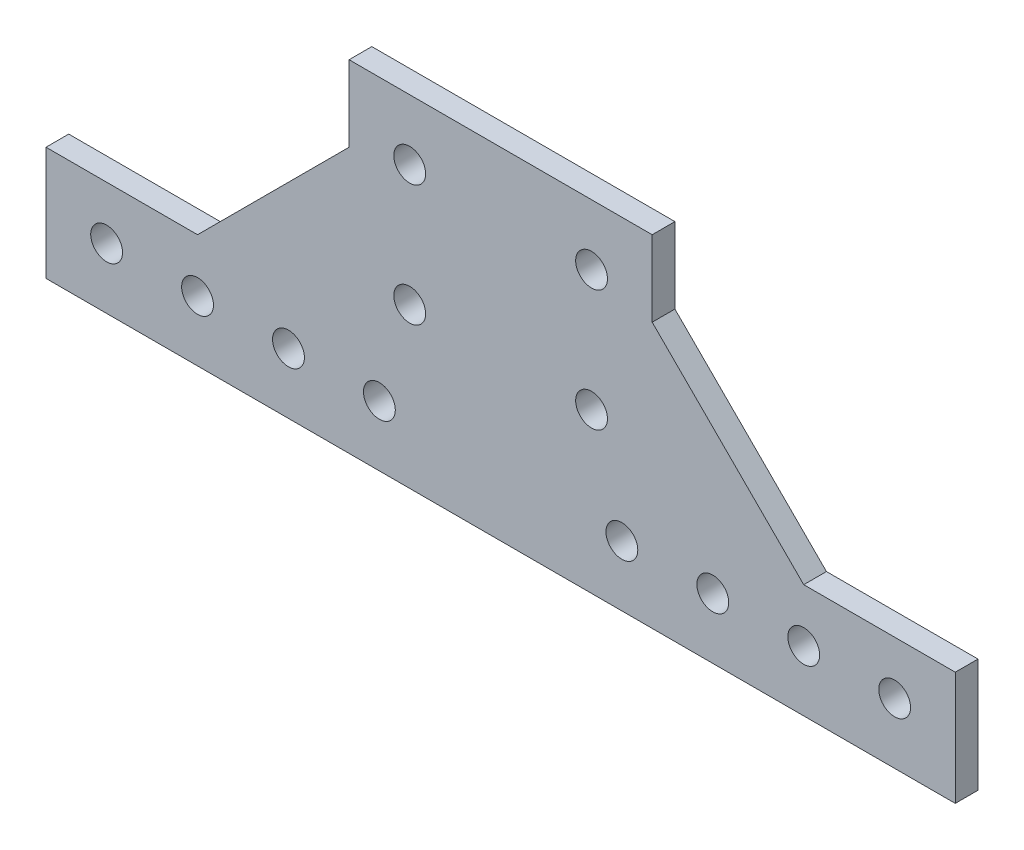
ISO-10303-21;
HEADER;
FILE_DESCRIPTION(('STEP AP214'),'2;1');
FILE_NAME('part.step','',(''),(''),'','','');
FILE_SCHEMA(('AUTOMOTIVE_DESIGN { 1 0 10303 214 1 1 1 1 }'));
ENDSEC;
DATA;
#1=APPLICATION_CONTEXT('core data for automotive mechanical design processes');
#2=APPLICATION_PROTOCOL_DEFINITION('international standard','automotive_design',2000,#1);
#3=PRODUCT_CONTEXT('',#1,'mechanical');
#4=PRODUCT('Part','Part','',(#3));
#5=PRODUCT_RELATED_PRODUCT_CATEGORY('part','',(#4));
#6=PRODUCT_DEFINITION_FORMATION('','',#4);
#7=PRODUCT_DEFINITION_CONTEXT('part definition',#1,'design');
#8=PRODUCT_DEFINITION('design','',#6,#7);
#9=PRODUCT_DEFINITION_SHAPE('','',#8);
#10=(LENGTH_UNIT() NAMED_UNIT(*) SI_UNIT(.MILLI.,.METRE.));
#11=(NAMED_UNIT(*) PLANE_ANGLE_UNIT() SI_UNIT($,.RADIAN.));
#12=(NAMED_UNIT(*) SI_UNIT($,.STERADIAN.) SOLID_ANGLE_UNIT());
#13=UNCERTAINTY_MEASURE_WITH_UNIT(LENGTH_MEASURE(1.E-05),#10,'distance_accuracy_value','');
#14=(GEOMETRIC_REPRESENTATION_CONTEXT(3) GLOBAL_UNCERTAINTY_ASSIGNED_CONTEXT((#13)) GLOBAL_UNIT_ASSIGNED_CONTEXT((#10,
#11,#12)) REPRESENTATION_CONTEXT('',''));
#15=CARTESIAN_POINT('',(0.,0.,0.));
#16=DIRECTION('',(0.,0.,1.));
#17=DIRECTION('',(1.,0.,0.));
#18=AXIS2_PLACEMENT_3D('',#15,#16,#17);
#19=CARTESIAN_POINT('',(0.,15.,3.));
#20=DIRECTION('',(1.,0.,0.));
#21=DIRECTION('',(0.,1.,0.));
#22=AXIS2_PLACEMENT_3D('',#19,#20,#21);
#23=PLANE('',#22);
#24=DIRECTION('',(0.,-1.,0.));
#25=VECTOR('',#24,1.);
#26=CARTESIAN_POINT('',(0.,15.,0.));
#27=LINE('',#26,#25);
#28=CARTESIAN_POINT('',(0.,15.,0.));
#29=VERTEX_POINT('',#28);
#30=CARTESIAN_POINT('',(0.,0.,0.));
#31=VERTEX_POINT('',#30);
#32=EDGE_CURVE('E147',#29,#31,#27,.T.);
#33=ORIENTED_EDGE('',*,*,#32,.T.);
#34=DIRECTION('',(0.,0.,-1.));
#35=VECTOR('',#34,1.);
#36=CARTESIAN_POINT('',(0.,0.,3.));
#37=LINE('',#36,#35);
#38=CARTESIAN_POINT('',(0.,0.,3.));
#39=VERTEX_POINT('',#38);
#40=EDGE_CURVE('E11',#39,#31,#37,.T.);
#41=ORIENTED_EDGE('',*,*,#40,.F.);
#42=DIRECTION('',(0.,-1.,0.));
#43=VECTOR('',#42,1.);
#44=CARTESIAN_POINT('',(0.,15.,3.));
#45=LINE('',#44,#43);
#46=CARTESIAN_POINT('',(0.,15.,3.));
#47=VERTEX_POINT('',#46);
#48=EDGE_CURVE('E166',#47,#39,#45,.T.);
#49=ORIENTED_EDGE('',*,*,#48,.F.);
#50=DIRECTION('',(0.,0.,-1.));
#51=VECTOR('',#50,1.);
#52=CARTESIAN_POINT('',(0.,15.,3.));
#53=LINE('',#52,#51);
#54=EDGE_CURVE('E143',#47,#29,#53,.T.);
#55=ORIENTED_EDGE('',*,*,#54,.T.);
#56=EDGE_LOOP('',(#33,#41,#49,#55));
#57=FACE_BOUND('',#56,.T.);
#58=ADVANCED_FACE('F39',(#57),#23,.F.);
#59=CARTESIAN_POINT('',(0.,0.,3.));
#60=DIRECTION('',(0.,1.,0.));
#61=DIRECTION('',(0.,0.,1.));
#62=AXIS2_PLACEMENT_3D('',#59,#60,#61);
#63=PLANE('',#62);
#64=DIRECTION('',(1.,0.,0.));
#65=VECTOR('',#64,1.);
#66=CARTESIAN_POINT('',(0.,0.,0.));
#67=LINE('',#66,#65);
#68=CARTESIAN_POINT('',(120.,0.,0.));
#69=VERTEX_POINT('',#68);
#70=EDGE_CURVE('E150',#31,#69,#67,.T.);
#71=ORIENTED_EDGE('',*,*,#70,.T.);
#72=DIRECTION('',(0.,0.,-1.));
#73=VECTOR('',#72,1.);
#74=CARTESIAN_POINT('',(120.,0.,3.));
#75=LINE('',#74,#73);
#76=CARTESIAN_POINT('',(120.,0.,3.));
#77=VERTEX_POINT('',#76);
#78=EDGE_CURVE('E47',#77,#69,#75,.T.);
#79=ORIENTED_EDGE('',*,*,#78,.F.);
#80=DIRECTION('',(1.,0.,0.));
#81=VECTOR('',#80,1.);
#82=CARTESIAN_POINT('',(0.,0.,3.));
#83=LINE('',#82,#81);
#84=EDGE_CURVE('E104',#39,#77,#83,.T.);
#85=ORIENTED_EDGE('',*,*,#84,.F.);
#86=ORIENTED_EDGE('',*,*,#40,.T.);
#87=EDGE_LOOP('',(#71,#79,#85,#86));
#88=FACE_BOUND('',#87,.T.);
#89=ADVANCED_FACE('F336',(#88),#63,.F.);
#90=CARTESIAN_POINT('',(120.,0.,3.));
#91=DIRECTION('',(-1.,0.,0.));
#92=DIRECTION('',(0.,0.,1.));
#93=AXIS2_PLACEMENT_3D('',#90,#91,#92);
#94=PLANE('',#93);
#95=DIRECTION('',(0.,1.,0.));
#96=VECTOR('',#95,1.);
#97=CARTESIAN_POINT('',(120.,0.,0.));
#98=LINE('',#97,#96);
#99=CARTESIAN_POINT('',(120.,15.,0.));
#100=VERTEX_POINT('',#99);
#101=EDGE_CURVE('E153',#69,#100,#98,.T.);
#102=ORIENTED_EDGE('',*,*,#101,.T.);
#103=DIRECTION('',(0.,0.,-1.));
#104=VECTOR('',#103,1.);
#105=CARTESIAN_POINT('',(120.,15.,3.));
#106=LINE('',#105,#104);
#107=CARTESIAN_POINT('',(120.,15.,3.));
#108=VERTEX_POINT('',#107);
#109=EDGE_CURVE('E179',#108,#100,#106,.T.);
#110=ORIENTED_EDGE('',*,*,#109,.F.);
#111=DIRECTION('',(0.,1.,0.));
#112=VECTOR('',#111,1.);
#113=CARTESIAN_POINT('',(120.,0.,3.));
#114=LINE('',#113,#112);
#115=EDGE_CURVE('E187',#77,#108,#114,.T.);
#116=ORIENTED_EDGE('',*,*,#115,.F.);
#117=ORIENTED_EDGE('',*,*,#78,.T.);
#118=EDGE_LOOP('',(#102,#110,#116,#117));
#119=FACE_BOUND('',#118,.T.);
#120=ADVANCED_FACE('F185',(#119),#94,.F.);
#121=CARTESIAN_POINT('',(120.,15.,3.));
#122=DIRECTION('',(0.,-1.,0.));
#123=DIRECTION('',(1.,0.,0.));
#124=AXIS2_PLACEMENT_3D('',#121,#122,#123);
#125=PLANE('',#124);
#126=DIRECTION('',(-1.,0.,0.));
#127=VECTOR('',#126,1.);
#128=CARTESIAN_POINT('',(120.,15.,0.));
#129=LINE('',#128,#127);
#130=CARTESIAN_POINT('',(100.,15.,0.));
#131=VERTEX_POINT('',#130);
#132=EDGE_CURVE('E155',#100,#131,#129,.T.);
#133=ORIENTED_EDGE('',*,*,#132,.T.);
#134=DIRECTION('',(0.,0.,-1.));
#135=VECTOR('',#134,1.);
#136=CARTESIAN_POINT('',(100.,15.,3.));
#137=LINE('',#136,#135);
#138=CARTESIAN_POINT('',(100.,15.,3.));
#139=VERTEX_POINT('',#138);
#140=EDGE_CURVE('E176',#139,#131,#137,.T.);
#141=ORIENTED_EDGE('',*,*,#140,.F.);
#142=DIRECTION('',(-1.,0.,0.));
#143=VECTOR('',#142,1.);
#144=CARTESIAN_POINT('',(120.,15.,3.));
#145=LINE('',#144,#143);
#146=EDGE_CURVE('E205',#108,#139,#145,.T.);
#147=ORIENTED_EDGE('',*,*,#146,.F.);
#148=ORIENTED_EDGE('',*,*,#109,.T.);
#149=EDGE_LOOP('',(#133,#141,#147,#148));
#150=FACE_BOUND('',#149,.T.);
#151=ADVANCED_FACE('F196',(#150),#125,.F.);
#152=CARTESIAN_POINT('',(100.,15.,3.));
#153=DIRECTION('',(-0.707106781186549,-0.707106781186546,0.));
#154=DIRECTION('',(0.707106781186546,-0.707106781186549,0.));
#155=AXIS2_PLACEMENT_3D('',#152,#153,#154);
#156=PLANE('',#155);
#157=DIRECTION('',(-0.707106781186546,0.707106781186549,0.));
#158=VECTOR('',#157,1.);
#159=CARTESIAN_POINT('',(100.,15.,0.));
#160=LINE('',#159,#158);
#161=CARTESIAN_POINT('',(80.0000000000001,35.0000000000001,0.));
#162=VERTEX_POINT('',#161);
#163=EDGE_CURVE('E157',#131,#162,#160,.T.);
#164=ORIENTED_EDGE('',*,*,#163,.T.);
#165=DIRECTION('',(0.,0.,-1.));
#166=VECTOR('',#165,1.);
#167=CARTESIAN_POINT('',(80.0000000000001,35.0000000000001,3.));
#168=LINE('',#167,#166);
#169=CARTESIAN_POINT('',(80.0000000000001,35.0000000000001,3.));
#170=VERTEX_POINT('',#169);
#171=EDGE_CURVE('E173',#170,#162,#168,.T.);
#172=ORIENTED_EDGE('',*,*,#171,.F.);
#173=DIRECTION('',(-0.707106781186546,0.707106781186549,0.));
#174=VECTOR('',#173,1.);
#175=CARTESIAN_POINT('',(100.,15.,3.));
#176=LINE('',#175,#174);
#177=EDGE_CURVE('E202',#139,#170,#176,.T.);
#178=ORIENTED_EDGE('',*,*,#177,.F.);
#179=ORIENTED_EDGE('',*,*,#140,.T.);
#180=EDGE_LOOP('',(#164,#172,#178,#179));
#181=FACE_BOUND('',#180,.T.);
#182=ADVANCED_FACE('F200',(#181),#156,.F.);
#183=CARTESIAN_POINT('',(80.0000000000001,35.0000000000001,3.));
#184=DIRECTION('',(-1.,0.,0.));
#185=DIRECTION('',(0.,-1.,0.));
#186=AXIS2_PLACEMENT_3D('',#183,#184,#185);
#187=PLANE('',#186);
#188=DIRECTION('',(0.,1.,0.));
#189=VECTOR('',#188,1.);
#190=CARTESIAN_POINT('',(80.0000000000001,35.0000000000001,0.));
#191=LINE('',#190,#189);
#192=CARTESIAN_POINT('',(80.0000000000001,45.,0.));
#193=VERTEX_POINT('',#192);
#194=EDGE_CURVE('E159',#162,#193,#191,.T.);
#195=ORIENTED_EDGE('',*,*,#194,.T.);
#196=DIRECTION('',(0.,0.,-1.));
#197=VECTOR('',#196,1.);
#198=CARTESIAN_POINT('',(80.0000000000001,45.,3.));
#199=LINE('',#198,#197);
#200=CARTESIAN_POINT('',(80.0000000000001,45.,3.));
#201=VERTEX_POINT('',#200);
#202=EDGE_CURVE('E170',#201,#193,#199,.T.);
#203=ORIENTED_EDGE('',*,*,#202,.F.);
#204=DIRECTION('',(0.,1.,0.));
#205=VECTOR('',#204,1.);
#206=CARTESIAN_POINT('',(80.0000000000001,35.0000000000001,3.));
#207=LINE('',#206,#205);
#208=EDGE_CURVE('E204',#170,#201,#207,.T.);
#209=ORIENTED_EDGE('',*,*,#208,.F.);
#210=ORIENTED_EDGE('',*,*,#171,.T.);
#211=EDGE_LOOP('',(#195,#203,#209,#210));
#212=FACE_BOUND('',#211,.T.);
#213=ADVANCED_FACE('F348',(#212),#187,.F.);
#214=CARTESIAN_POINT('',(80.0000000000001,45.,3.));
#215=DIRECTION('',(0.,-1.,0.));
#216=DIRECTION('',(1.,0.,0.));
#217=AXIS2_PLACEMENT_3D('',#214,#215,#216);
#218=PLANE('',#217);
#219=DIRECTION('',(-1.,0.,0.));
#220=VECTOR('',#219,1.);
#221=CARTESIAN_POINT('',(80.0000000000001,45.,0.));
#222=LINE('',#221,#220);
#223=CARTESIAN_POINT('',(40.0000000000001,45.,0.));
#224=VERTEX_POINT('',#223);
#225=EDGE_CURVE('E161',#193,#224,#222,.T.);
#226=ORIENTED_EDGE('',*,*,#225,.T.);
#227=DIRECTION('',(0.,0.,-1.));
#228=VECTOR('',#227,1.);
#229=CARTESIAN_POINT('',(40.0000000000001,45.,3.));
#230=LINE('',#229,#228);
#231=CARTESIAN_POINT('',(40.0000000000001,45.,3.));
#232=VERTEX_POINT('',#231);
#233=EDGE_CURVE('E138',#232,#224,#230,.T.);
#234=ORIENTED_EDGE('',*,*,#233,.F.);
#235=DIRECTION('',(-1.,0.,0.));
#236=VECTOR('',#235,1.);
#237=CARTESIAN_POINT('',(80.0000000000001,45.,3.));
#238=LINE('',#237,#236);
#239=EDGE_CURVE('E129',#201,#232,#238,.T.);
#240=ORIENTED_EDGE('',*,*,#239,.F.);
#241=ORIENTED_EDGE('',*,*,#202,.T.);
#242=EDGE_LOOP('',(#226,#234,#240,#241));
#243=FACE_BOUND('',#242,.T.);
#244=ADVANCED_FACE('F345',(#243),#218,.F.);
#245=CARTESIAN_POINT('',(40.0000000000001,45.,3.));
#246=DIRECTION('',(1.,0.,0.));
#247=DIRECTION('',(0.,1.,0.));
#248=AXIS2_PLACEMENT_3D('',#245,#246,#247);
#249=PLANE('',#248);
#250=DIRECTION('',(0.,-1.,0.));
#251=VECTOR('',#250,1.);
#252=CARTESIAN_POINT('',(40.0000000000001,45.,0.));
#253=LINE('',#252,#251);
#254=CARTESIAN_POINT('',(40.,35.0000000000001,0.));
#255=VERTEX_POINT('',#254);
#256=EDGE_CURVE('E137',#224,#255,#253,.T.);
#257=ORIENTED_EDGE('',*,*,#256,.T.);
#258=DIRECTION('',(0.,0.,-1.));
#259=VECTOR('',#258,1.);
#260=CARTESIAN_POINT('',(40.,35.0000000000001,3.));
#261=LINE('',#260,#259);
#262=CARTESIAN_POINT('',(40.,35.0000000000001,3.));
#263=VERTEX_POINT('',#262);
#264=EDGE_CURVE('E134',#263,#255,#261,.T.);
#265=ORIENTED_EDGE('',*,*,#264,.F.);
#266=DIRECTION('',(0.,-1.,0.));
#267=VECTOR('',#266,1.);
#268=CARTESIAN_POINT('',(40.0000000000001,45.,3.));
#269=LINE('',#268,#267);
#270=EDGE_CURVE('E123',#232,#263,#269,.T.);
#271=ORIENTED_EDGE('',*,*,#270,.F.);
#272=ORIENTED_EDGE('',*,*,#233,.T.);
#273=EDGE_LOOP('',(#257,#265,#271,#272));
#274=FACE_BOUND('',#273,.T.);
#275=ADVANCED_FACE('F135',(#274),#249,.F.);
#276=CARTESIAN_POINT('',(40.,35.0000000000001,3.));
#277=DIRECTION('',(0.70710678118655,-0.707106781186545,0.));
#278=DIRECTION('',(0.707106781186545,0.70710678118655,0.));
#279=AXIS2_PLACEMENT_3D('',#276,#277,#278);
#280=PLANE('',#279);
#281=DIRECTION('',(-0.707106781186545,-0.70710678118655,0.));
#282=VECTOR('',#281,1.);
#283=CARTESIAN_POINT('',(40.,35.0000000000001,0.));
#284=LINE('',#283,#282);
#285=CARTESIAN_POINT('',(20.,15.,0.));
#286=VERTEX_POINT('',#285);
#287=EDGE_CURVE('E90',#255,#286,#284,.T.);
#288=ORIENTED_EDGE('',*,*,#287,.T.);
#289=DIRECTION('',(0.,0.,-1.));
#290=VECTOR('',#289,1.);
#291=CARTESIAN_POINT('',(20.,15.,3.));
#292=LINE('',#291,#290);
#293=CARTESIAN_POINT('',(20.,15.,3.));
#294=VERTEX_POINT('',#293);
#295=EDGE_CURVE('E139',#294,#286,#292,.T.);
#296=ORIENTED_EDGE('',*,*,#295,.F.);
#297=DIRECTION('',(-0.707106781186545,-0.70710678118655,0.));
#298=VECTOR('',#297,1.);
#299=CARTESIAN_POINT('',(40.,35.0000000000001,3.));
#300=LINE('',#299,#298);
#301=EDGE_CURVE('E127',#263,#294,#300,.T.);
#302=ORIENTED_EDGE('',*,*,#301,.F.);
#303=ORIENTED_EDGE('',*,*,#264,.T.);
#304=EDGE_LOOP('',(#288,#296,#302,#303));
#305=FACE_BOUND('',#304,.T.);
#306=ADVANCED_FACE('F141',(#305),#280,.F.);
#307=CARTESIAN_POINT('',(20.,15.,3.));
#308=DIRECTION('',(0.,-1.,0.));
#309=DIRECTION('',(1.,0.,0.));
#310=AXIS2_PLACEMENT_3D('',#307,#308,#309);
#311=PLANE('',#310);
#312=DIRECTION('',(-1.,0.,0.));
#313=VECTOR('',#312,1.);
#314=CARTESIAN_POINT('',(20.,15.,0.));
#315=LINE('',#314,#313);
#316=EDGE_CURVE('E96',#286,#29,#315,.T.);
#317=ORIENTED_EDGE('',*,*,#316,.T.);
#318=ORIENTED_EDGE('',*,*,#54,.F.);
#319=DIRECTION('',(-1.,0.,0.));
#320=VECTOR('',#319,1.);
#321=CARTESIAN_POINT('',(20.,15.,3.));
#322=LINE('',#321,#320);
#323=EDGE_CURVE('E55',#294,#47,#322,.T.);
#324=ORIENTED_EDGE('',*,*,#323,.F.);
#325=ORIENTED_EDGE('',*,*,#295,.T.);
#326=EDGE_LOOP('',(#317,#318,#324,#325));
#327=FACE_BOUND('',#326,.T.);
#328=ADVANCED_FACE('F296',(#327),#311,.F.);
#329=CARTESIAN_POINT('',(0.,0.,3.));
#330=DIRECTION('',(0.,0.,1.));
#331=DIRECTION('',(1.,0.,0.));
#332=AXIS2_PLACEMENT_3D('',#329,#330,#331);
#333=PLANE('',#332);
#334=CARTESIAN_POINT('',(32.,8.,3.));
#335=DIRECTION('',(0.,0.,1.));
#336=DIRECTION('',(1.,0.,0.));
#337=AXIS2_PLACEMENT_3D('',#334,#335,#336);
#338=CIRCLE('',#337,2.1);
#339=CARTESIAN_POINT('',(34.1,8.,3.));
#340=VERTEX_POINT('',#339);
#341=EDGE_CURVE('E279',#340,#340,#338,.T.);
#342=ORIENTED_EDGE('',*,*,#341,.F.);
#343=EDGE_LOOP('',(#342));
#344=FACE_BOUND('',#343,.T.);
#345=CARTESIAN_POINT('',(44.,8.,3.));
#346=DIRECTION('',(0.,0.,1.));
#347=DIRECTION('',(1.,0.,0.));
#348=AXIS2_PLACEMENT_3D('',#345,#346,#347);
#349=CIRCLE('',#348,2.1);
#350=CARTESIAN_POINT('',(46.1,8.,3.));
#351=VERTEX_POINT('',#350);
#352=EDGE_CURVE('E273',#351,#351,#349,.T.);
#353=ORIENTED_EDGE('',*,*,#352,.F.);
#354=EDGE_LOOP('',(#353));
#355=FACE_BOUND('',#354,.T.);
#356=CARTESIAN_POINT('',(76.0000000000001,8.,3.));
#357=DIRECTION('',(0.,0.,1.));
#358=DIRECTION('',(1.,0.,0.));
#359=AXIS2_PLACEMENT_3D('',#356,#357,#358);
#360=CIRCLE('',#359,2.1);
#361=CARTESIAN_POINT('',(78.1000000000001,8.,3.));
#362=VERTEX_POINT('',#361);
#363=EDGE_CURVE('E267',#362,#362,#360,.T.);
#364=ORIENTED_EDGE('',*,*,#363,.F.);
#365=EDGE_LOOP('',(#364));
#366=FACE_BOUND('',#365,.T.);
#367=CARTESIAN_POINT('',(88.0000000000001,8.,3.));
#368=DIRECTION('',(0.,0.,1.));
#369=DIRECTION('',(1.,0.,0.));
#370=AXIS2_PLACEMENT_3D('',#367,#368,#369);
#371=CIRCLE('',#370,2.1);
#372=CARTESIAN_POINT('',(90.1000000000001,8.,3.));
#373=VERTEX_POINT('',#372);
#374=EDGE_CURVE('E261',#373,#373,#371,.T.);
#375=ORIENTED_EDGE('',*,*,#374,.F.);
#376=EDGE_LOOP('',(#375));
#377=FACE_BOUND('',#376,.T.);
#378=CARTESIAN_POINT('',(8.,8.,3.));
#379=DIRECTION('',(0.,0.,1.));
#380=DIRECTION('',(1.,0.,0.));
#381=AXIS2_PLACEMENT_3D('',#378,#379,#380);
#382=CIRCLE('',#381,2.1);
#383=CARTESIAN_POINT('',(10.1,8.,3.));
#384=VERTEX_POINT('',#383);
#385=EDGE_CURVE('E231',#384,#384,#382,.T.);
#386=ORIENTED_EDGE('',*,*,#385,.F.);
#387=EDGE_LOOP('',(#386));
#388=FACE_BOUND('',#387,.T.);
#389=CARTESIAN_POINT('',(72.0000000000001,21.,3.));
#390=DIRECTION('',(0.,0.,1.));
#391=DIRECTION('',(1.,0.,0.));
#392=AXIS2_PLACEMENT_3D('',#389,#390,#391);
#393=CIRCLE('',#392,2.09999999999999);
#394=CARTESIAN_POINT('',(74.1000000000001,21.,3.));
#395=VERTEX_POINT('',#394);
#396=EDGE_CURVE('E238',#395,#395,#393,.T.);
#397=ORIENTED_EDGE('',*,*,#396,.F.);
#398=EDGE_LOOP('',(#397));
#399=FACE_BOUND('',#398,.T.);
#400=CARTESIAN_POINT('',(48.0000000000001,21.,3.));
#401=DIRECTION('',(0.,0.,1.));
#402=DIRECTION('',(1.,0.,0.));
#403=AXIS2_PLACEMENT_3D('',#400,#401,#402);
#404=CIRCLE('',#403,2.1);
#405=CARTESIAN_POINT('',(50.1000000000001,21.,3.));
#406=VERTEX_POINT('',#405);
#407=EDGE_CURVE('E219',#406,#406,#404,.T.);
#408=ORIENTED_EDGE('',*,*,#407,.F.);
#409=EDGE_LOOP('',(#408));
#410=FACE_BOUND('',#409,.T.);
#411=CARTESIAN_POINT('',(72.0000000000001,37.,3.));
#412=DIRECTION('',(0.,0.,1.));
#413=DIRECTION('',(1.,0.,0.));
#414=AXIS2_PLACEMENT_3D('',#411,#412,#413);
#415=CIRCLE('',#414,2.09999999999999);
#416=CARTESIAN_POINT('',(74.1000000000001,37.,3.));
#417=VERTEX_POINT('',#416);
#418=EDGE_CURVE('E226',#417,#417,#415,.T.);
#419=ORIENTED_EDGE('',*,*,#418,.F.);
#420=EDGE_LOOP('',(#419));
#421=FACE_BOUND('',#420,.T.);
#422=CARTESIAN_POINT('',(20.,8.,3.));
#423=DIRECTION('',(0.,0.,1.));
#424=DIRECTION('',(1.,0.,0.));
#425=AXIS2_PLACEMENT_3D('',#422,#423,#424);
#426=CIRCLE('',#425,2.1);
#427=CARTESIAN_POINT('',(22.1,8.,3.));
#428=VERTEX_POINT('',#427);
#429=EDGE_CURVE('E256',#428,#428,#426,.T.);
#430=ORIENTED_EDGE('',*,*,#429,.F.);
#431=EDGE_LOOP('',(#430));
#432=FACE_BOUND('',#431,.T.);
#433=CARTESIAN_POINT('',(100.,8.,3.));
#434=DIRECTION('',(0.,0.,1.));
#435=DIRECTION('',(1.,0.,0.));
#436=AXIS2_PLACEMENT_3D('',#433,#434,#435);
#437=CIRCLE('',#436,2.1);
#438=CARTESIAN_POINT('',(102.1,8.,3.));
#439=VERTEX_POINT('',#438);
#440=EDGE_CURVE('E250',#439,#439,#437,.T.);
#441=ORIENTED_EDGE('',*,*,#440,.F.);
#442=EDGE_LOOP('',(#441));
#443=FACE_BOUND('',#442,.T.);
#444=CARTESIAN_POINT('',(112.,8.,3.));
#445=DIRECTION('',(0.,0.,1.));
#446=DIRECTION('',(1.,0.,0.));
#447=AXIS2_PLACEMENT_3D('',#444,#445,#446);
#448=CIRCLE('',#447,2.1);
#449=CARTESIAN_POINT('',(114.1,8.,3.));
#450=VERTEX_POINT('',#449);
#451=EDGE_CURVE('E243',#450,#450,#448,.T.);
#452=ORIENTED_EDGE('',*,*,#451,.F.);
#453=EDGE_LOOP('',(#452));
#454=FACE_BOUND('',#453,.T.);
#455=CARTESIAN_POINT('',(48.0000000000001,37.,3.));
#456=DIRECTION('',(0.,0.,1.));
#457=DIRECTION('',(1.,0.,0.));
#458=AXIS2_PLACEMENT_3D('',#455,#456,#457);
#459=CIRCLE('',#458,2.1);
#460=CARTESIAN_POINT('',(50.1000000000001,37.,3.));
#461=VERTEX_POINT('',#460);
#462=EDGE_CURVE('E213',#461,#461,#459,.T.);
#463=ORIENTED_EDGE('',*,*,#462,.F.);
#464=EDGE_LOOP('',(#463));
#465=FACE_BOUND('',#464,.T.);
#466=ORIENTED_EDGE('',*,*,#48,.T.);
#467=ORIENTED_EDGE('',*,*,#84,.T.);
#468=ORIENTED_EDGE('',*,*,#115,.T.);
#469=ORIENTED_EDGE('',*,*,#146,.T.);
#470=ORIENTED_EDGE('',*,*,#177,.T.);
#471=ORIENTED_EDGE('',*,*,#208,.T.);
#472=ORIENTED_EDGE('',*,*,#239,.T.);
#473=ORIENTED_EDGE('',*,*,#270,.T.);
#474=ORIENTED_EDGE('',*,*,#301,.T.);
#475=ORIENTED_EDGE('',*,*,#323,.T.);
#476=EDGE_LOOP('',(#466,#467,#468,#469,#470,#471,#472,#473,#474,#475));
#477=FACE_BOUND('',#476,.T.);
#478=ADVANCED_FACE('F125',(#344,#355,#366,#377,#388,#399,#410,#421,#432,#443,#454,#465,#477),
#333,.T.);
#479=CARTESIAN_POINT('',(0.,0.,0.));
#480=DIRECTION('',(0.,0.,1.));
#481=DIRECTION('',(1.,0.,0.));
#482=AXIS2_PLACEMENT_3D('',#479,#480,#481);
#483=PLANE('',#482);
#484=CARTESIAN_POINT('',(32.,8.,0.));
#485=DIRECTION('',(0.,0.,1.));
#486=DIRECTION('',(1.,0.,0.));
#487=AXIS2_PLACEMENT_3D('',#484,#485,#486);
#488=CIRCLE('',#487,2.1);
#489=CARTESIAN_POINT('',(34.1,8.,0.));
#490=VERTEX_POINT('',#489);
#491=EDGE_CURVE('E247',#490,#490,#488,.T.);
#492=ORIENTED_EDGE('',*,*,#491,.T.);
#493=EDGE_LOOP('',(#492));
#494=FACE_BOUND('',#493,.T.);
#495=CARTESIAN_POINT('',(44.,8.,0.));
#496=DIRECTION('',(0.,0.,1.));
#497=DIRECTION('',(1.,0.,0.));
#498=AXIS2_PLACEMENT_3D('',#495,#496,#497);
#499=CIRCLE('',#498,2.1);
#500=CARTESIAN_POINT('',(46.1,8.,0.));
#501=VERTEX_POINT('',#500);
#502=EDGE_CURVE('E276',#501,#501,#499,.T.);
#503=ORIENTED_EDGE('',*,*,#502,.T.);
#504=EDGE_LOOP('',(#503));
#505=FACE_BOUND('',#504,.T.);
#506=CARTESIAN_POINT('',(76.0000000000001,8.,0.));
#507=DIRECTION('',(0.,0.,1.));
#508=DIRECTION('',(1.,0.,0.));
#509=AXIS2_PLACEMENT_3D('',#506,#507,#508);
#510=CIRCLE('',#509,2.1);
#511=CARTESIAN_POINT('',(78.1000000000001,8.,0.));
#512=VERTEX_POINT('',#511);
#513=EDGE_CURVE('E270',#512,#512,#510,.T.);
#514=ORIENTED_EDGE('',*,*,#513,.T.);
#515=EDGE_LOOP('',(#514));
#516=FACE_BOUND('',#515,.T.);
#517=CARTESIAN_POINT('',(88.0000000000001,8.,0.));
#518=DIRECTION('',(0.,0.,1.));
#519=DIRECTION('',(1.,0.,0.));
#520=AXIS2_PLACEMENT_3D('',#517,#518,#519);
#521=CIRCLE('',#520,2.1);
#522=CARTESIAN_POINT('',(90.1000000000001,8.,0.));
#523=VERTEX_POINT('',#522);
#524=EDGE_CURVE('E264',#523,#523,#521,.T.);
#525=ORIENTED_EDGE('',*,*,#524,.T.);
#526=EDGE_LOOP('',(#525));
#527=FACE_BOUND('',#526,.T.);
#528=CARTESIAN_POINT('',(8.,8.,0.));
#529=DIRECTION('',(0.,0.,1.));
#530=DIRECTION('',(1.,0.,0.));
#531=AXIS2_PLACEMENT_3D('',#528,#529,#530);
#532=CIRCLE('',#531,2.1);
#533=CARTESIAN_POINT('',(10.1,8.,0.));
#534=VERTEX_POINT('',#533);
#535=EDGE_CURVE('E234',#534,#534,#532,.T.);
#536=ORIENTED_EDGE('',*,*,#535,.T.);
#537=EDGE_LOOP('',(#536));
#538=FACE_BOUND('',#537,.T.);
#539=CARTESIAN_POINT('',(72.0000000000001,21.,0.));
#540=DIRECTION('',(0.,0.,1.));
#541=DIRECTION('',(1.,0.,0.));
#542=AXIS2_PLACEMENT_3D('',#539,#540,#541);
#543=CIRCLE('',#542,2.09999999999999);
#544=CARTESIAN_POINT('',(74.1000000000001,21.,0.));
#545=VERTEX_POINT('',#544);
#546=EDGE_CURVE('E223',#545,#545,#543,.T.);
#547=ORIENTED_EDGE('',*,*,#546,.T.);
#548=EDGE_LOOP('',(#547));
#549=FACE_BOUND('',#548,.T.);
#550=CARTESIAN_POINT('',(48.0000000000001,21.,0.));
#551=DIRECTION('',(0.,0.,1.));
#552=DIRECTION('',(1.,0.,0.));
#553=AXIS2_PLACEMENT_3D('',#550,#551,#552);
#554=CIRCLE('',#553,2.1);
#555=CARTESIAN_POINT('',(50.1000000000001,21.,0.));
#556=VERTEX_POINT('',#555);
#557=EDGE_CURVE('E222',#556,#556,#554,.T.);
#558=ORIENTED_EDGE('',*,*,#557,.T.);
#559=EDGE_LOOP('',(#558));
#560=FACE_BOUND('',#559,.T.);
#561=CARTESIAN_POINT('',(72.0000000000001,37.,0.));
#562=DIRECTION('',(0.,0.,1.));
#563=DIRECTION('',(1.,0.,0.));
#564=AXIS2_PLACEMENT_3D('',#561,#562,#563);
#565=CIRCLE('',#564,2.09999999999999);
#566=CARTESIAN_POINT('',(74.1000000000001,37.,0.));
#567=VERTEX_POINT('',#566);
#568=EDGE_CURVE('E216',#567,#567,#565,.T.);
#569=ORIENTED_EDGE('',*,*,#568,.T.);
#570=EDGE_LOOP('',(#569));
#571=FACE_BOUND('',#570,.T.);
#572=CARTESIAN_POINT('',(20.,8.,0.));
#573=DIRECTION('',(0.,0.,1.));
#574=DIRECTION('',(1.,0.,0.));
#575=AXIS2_PLACEMENT_3D('',#572,#573,#574);
#576=CIRCLE('',#575,2.1);
#577=CARTESIAN_POINT('',(22.1,8.,0.));
#578=VERTEX_POINT('',#577);
#579=EDGE_CURVE('E235',#578,#578,#576,.T.);
#580=ORIENTED_EDGE('',*,*,#579,.T.);
#581=EDGE_LOOP('',(#580));
#582=FACE_BOUND('',#581,.T.);
#583=CARTESIAN_POINT('',(100.,8.,0.));
#584=DIRECTION('',(0.,0.,1.));
#585=DIRECTION('',(1.,0.,0.));
#586=AXIS2_PLACEMENT_3D('',#583,#584,#585);
#587=CIRCLE('',#586,2.1);
#588=CARTESIAN_POINT('',(102.1,8.,0.));
#589=VERTEX_POINT('',#588);
#590=EDGE_CURVE('E253',#589,#589,#587,.T.);
#591=ORIENTED_EDGE('',*,*,#590,.T.);
#592=EDGE_LOOP('',(#591));
#593=FACE_BOUND('',#592,.T.);
#594=CARTESIAN_POINT('',(112.,8.,0.));
#595=DIRECTION('',(0.,0.,1.));
#596=DIRECTION('',(1.,0.,0.));
#597=AXIS2_PLACEMENT_3D('',#594,#595,#596);
#598=CIRCLE('',#597,2.1);
#599=CARTESIAN_POINT('',(114.1,8.,0.));
#600=VERTEX_POINT('',#599);
#601=EDGE_CURVE('E246',#600,#600,#598,.T.);
#602=ORIENTED_EDGE('',*,*,#601,.T.);
#603=EDGE_LOOP('',(#602));
#604=FACE_BOUND('',#603,.T.);
#605=CARTESIAN_POINT('',(48.0000000000001,37.,0.));
#606=DIRECTION('',(0.,0.,1.));
#607=DIRECTION('',(1.,0.,0.));
#608=AXIS2_PLACEMENT_3D('',#605,#606,#607);
#609=CIRCLE('',#608,2.1);
#610=CARTESIAN_POINT('',(50.1000000000001,37.,0.));
#611=VERTEX_POINT('',#610);
#612=EDGE_CURVE('E151',#611,#611,#609,.T.);
#613=ORIENTED_EDGE('',*,*,#612,.T.);
#614=EDGE_LOOP('',(#613));
#615=FACE_BOUND('',#614,.T.);
#616=ORIENTED_EDGE('',*,*,#32,.F.);
#617=ORIENTED_EDGE('',*,*,#316,.F.);
#618=ORIENTED_EDGE('',*,*,#287,.F.);
#619=ORIENTED_EDGE('',*,*,#256,.F.);
#620=ORIENTED_EDGE('',*,*,#225,.F.);
#621=ORIENTED_EDGE('',*,*,#194,.F.);
#622=ORIENTED_EDGE('',*,*,#163,.F.);
#623=ORIENTED_EDGE('',*,*,#132,.F.);
#624=ORIENTED_EDGE('',*,*,#101,.F.);
#625=ORIENTED_EDGE('',*,*,#70,.F.);
#626=EDGE_LOOP('',(#616,#617,#618,#619,#620,#621,#622,#623,#624,#625));
#627=FACE_BOUND('',#626,.T.);
#628=ADVANCED_FACE('F191',(#494,#505,#516,#527,#538,#549,#560,#571,#582,#593,#604,#615,#627),
#483,.F.);
#629=CARTESIAN_POINT('',(48.0000000000001,37.,0.));
#630=DIRECTION('',(0.,0.,1.));
#631=DIRECTION('',(1.,0.,0.));
#632=AXIS2_PLACEMENT_3D('',#629,#630,#631);
#633=CYLINDRICAL_SURFACE('',#632,2.1);
#634=ORIENTED_EDGE('',*,*,#612,.F.);
#635=EDGE_LOOP('',(#634));
#636=FACE_BOUND('',#635,.T.);
#637=ORIENTED_EDGE('',*,*,#462,.T.);
#638=EDGE_LOOP('',(#637));
#639=FACE_BOUND('',#638,.T.);
#640=ADVANCED_FACE('F320',(#636,#639),#633,.F.);
#641=CARTESIAN_POINT('',(112.,8.,0.));
#642=DIRECTION('',(0.,0.,1.));
#643=DIRECTION('',(1.,0.,0.));
#644=AXIS2_PLACEMENT_3D('',#641,#642,#643);
#645=CYLINDRICAL_SURFACE('',#644,2.1);
#646=ORIENTED_EDGE('',*,*,#601,.F.);
#647=EDGE_LOOP('',(#646));
#648=FACE_BOUND('',#647,.T.);
#649=ORIENTED_EDGE('',*,*,#451,.T.);
#650=EDGE_LOOP('',(#649));
#651=FACE_BOUND('',#650,.T.);
#652=ADVANCED_FACE('F322',(#648,#651),#645,.F.);
#653=CARTESIAN_POINT('',(100.,8.,0.));
#654=DIRECTION('',(0.,0.,1.));
#655=DIRECTION('',(1.,0.,0.));
#656=AXIS2_PLACEMENT_3D('',#653,#654,#655);
#657=CYLINDRICAL_SURFACE('',#656,2.1);
#658=ORIENTED_EDGE('',*,*,#590,.F.);
#659=EDGE_LOOP('',(#658));
#660=FACE_BOUND('',#659,.T.);
#661=ORIENTED_EDGE('',*,*,#440,.T.);
#662=EDGE_LOOP('',(#661));
#663=FACE_BOUND('',#662,.T.);
#664=ADVANCED_FACE('F329',(#660,#663),#657,.F.);
#665=CARTESIAN_POINT('',(20.,8.,0.));
#666=DIRECTION('',(0.,0.,1.));
#667=DIRECTION('',(1.,0.,0.));
#668=AXIS2_PLACEMENT_3D('',#665,#666,#667);
#669=CYLINDRICAL_SURFACE('',#668,2.1);
#670=ORIENTED_EDGE('',*,*,#579,.F.);
#671=EDGE_LOOP('',(#670));
#672=FACE_BOUND('',#671,.T.);
#673=ORIENTED_EDGE('',*,*,#429,.T.);
#674=EDGE_LOOP('',(#673));
#675=FACE_BOUND('',#674,.T.);
#676=ADVANCED_FACE('F428',(#672,#675),#669,.F.);
#677=CARTESIAN_POINT('',(72.0000000000001,37.,0.));
#678=DIRECTION('',(0.,0.,1.));
#679=DIRECTION('',(1.,0.,0.));
#680=AXIS2_PLACEMENT_3D('',#677,#678,#679);
#681=CYLINDRICAL_SURFACE('',#680,2.09999999999999);
#682=ORIENTED_EDGE('',*,*,#568,.F.);
#683=EDGE_LOOP('',(#682));
#684=FACE_BOUND('',#683,.T.);
#685=ORIENTED_EDGE('',*,*,#418,.T.);
#686=EDGE_LOOP('',(#685));
#687=FACE_BOUND('',#686,.T.);
#688=ADVANCED_FACE('F438',(#684,#687),#681,.F.);
#689=CARTESIAN_POINT('',(48.0000000000001,21.,0.));
#690=DIRECTION('',(0.,0.,1.));
#691=DIRECTION('',(1.,0.,0.));
#692=AXIS2_PLACEMENT_3D('',#689,#690,#691);
#693=CYLINDRICAL_SURFACE('',#692,2.1);
#694=ORIENTED_EDGE('',*,*,#557,.F.);
#695=EDGE_LOOP('',(#694));
#696=FACE_BOUND('',#695,.T.);
#697=ORIENTED_EDGE('',*,*,#407,.T.);
#698=EDGE_LOOP('',(#697));
#699=FACE_BOUND('',#698,.T.);
#700=ADVANCED_FACE('F448',(#696,#699),#693,.F.);
#701=CARTESIAN_POINT('',(72.0000000000001,21.,0.));
#702=DIRECTION('',(0.,0.,1.));
#703=DIRECTION('',(1.,0.,0.));
#704=AXIS2_PLACEMENT_3D('',#701,#702,#703);
#705=CYLINDRICAL_SURFACE('',#704,2.09999999999999);
#706=ORIENTED_EDGE('',*,*,#546,.F.);
#707=EDGE_LOOP('',(#706));
#708=FACE_BOUND('',#707,.T.);
#709=ORIENTED_EDGE('',*,*,#396,.T.);
#710=EDGE_LOOP('',(#709));
#711=FACE_BOUND('',#710,.T.);
#712=ADVANCED_FACE('F458',(#708,#711),#705,.F.);
#713=CARTESIAN_POINT('',(8.,8.,0.));
#714=DIRECTION('',(0.,0.,1.));
#715=DIRECTION('',(1.,0.,0.));
#716=AXIS2_PLACEMENT_3D('',#713,#714,#715);
#717=CYLINDRICAL_SURFACE('',#716,2.1);
#718=ORIENTED_EDGE('',*,*,#535,.F.);
#719=EDGE_LOOP('',(#718));
#720=FACE_BOUND('',#719,.T.);
#721=ORIENTED_EDGE('',*,*,#385,.T.);
#722=EDGE_LOOP('',(#721));
#723=FACE_BOUND('',#722,.T.);
#724=ADVANCED_FACE('F467',(#720,#723),#717,.F.);
#725=CARTESIAN_POINT('',(88.0000000000001,8.,0.));
#726=DIRECTION('',(0.,0.,1.));
#727=DIRECTION('',(1.,0.,0.));
#728=AXIS2_PLACEMENT_3D('',#725,#726,#727);
#729=CYLINDRICAL_SURFACE('',#728,2.1);
#730=ORIENTED_EDGE('',*,*,#524,.F.);
#731=EDGE_LOOP('',(#730));
#732=FACE_BOUND('',#731,.T.);
#733=ORIENTED_EDGE('',*,*,#374,.T.);
#734=EDGE_LOOP('',(#733));
#735=FACE_BOUND('',#734,.T.);
#736=ADVANCED_FACE('F477',(#732,#735),#729,.F.);
#737=CARTESIAN_POINT('',(76.0000000000001,8.,0.));
#738=DIRECTION('',(0.,0.,1.));
#739=DIRECTION('',(1.,0.,0.));
#740=AXIS2_PLACEMENT_3D('',#737,#738,#739);
#741=CYLINDRICAL_SURFACE('',#740,2.1);
#742=ORIENTED_EDGE('',*,*,#513,.F.);
#743=EDGE_LOOP('',(#742));
#744=FACE_BOUND('',#743,.T.);
#745=ORIENTED_EDGE('',*,*,#363,.T.);
#746=EDGE_LOOP('',(#745));
#747=FACE_BOUND('',#746,.T.);
#748=ADVANCED_FACE('F497',(#744,#747),#741,.F.);
#749=CARTESIAN_POINT('',(44.,8.,0.));
#750=DIRECTION('',(0.,0.,1.));
#751=DIRECTION('',(1.,0.,0.));
#752=AXIS2_PLACEMENT_3D('',#749,#750,#751);
#753=CYLINDRICAL_SURFACE('',#752,2.1);
#754=ORIENTED_EDGE('',*,*,#502,.F.);
#755=EDGE_LOOP('',(#754));
#756=FACE_BOUND('',#755,.T.);
#757=ORIENTED_EDGE('',*,*,#352,.T.);
#758=EDGE_LOOP('',(#757));
#759=FACE_BOUND('',#758,.T.);
#760=ADVANCED_FACE('F290',(#756,#759),#753,.F.);
#761=CARTESIAN_POINT('',(32.,8.,0.));
#762=DIRECTION('',(0.,0.,1.));
#763=DIRECTION('',(1.,0.,0.));
#764=AXIS2_PLACEMENT_3D('',#761,#762,#763);
#765=CYLINDRICAL_SURFACE('',#764,2.1);
#766=ORIENTED_EDGE('',*,*,#491,.F.);
#767=EDGE_LOOP('',(#766));
#768=FACE_BOUND('',#767,.T.);
#769=ORIENTED_EDGE('',*,*,#341,.T.);
#770=EDGE_LOOP('',(#769));
#771=FACE_BOUND('',#770,.T.);
#772=ADVANCED_FACE('F287',(#768,#771),#765,.F.);
#773=CLOSED_SHELL('',(#58,#89,#120,#151,#182,#213,#244,#275,#306,#328,#478,#628,#640,#652,#664,
#676,#688,#700,#712,#724,#736,#748,#760,#772));
#774=MANIFOLD_SOLID_BREP('B2',#773);
#775=ADVANCED_BREP_SHAPE_REPRESENTATION('',(#18,#774),#14);
#776=SHAPE_DEFINITION_REPRESENTATION(#9,#775);
ENDSEC;
END-ISO-10303-21;
